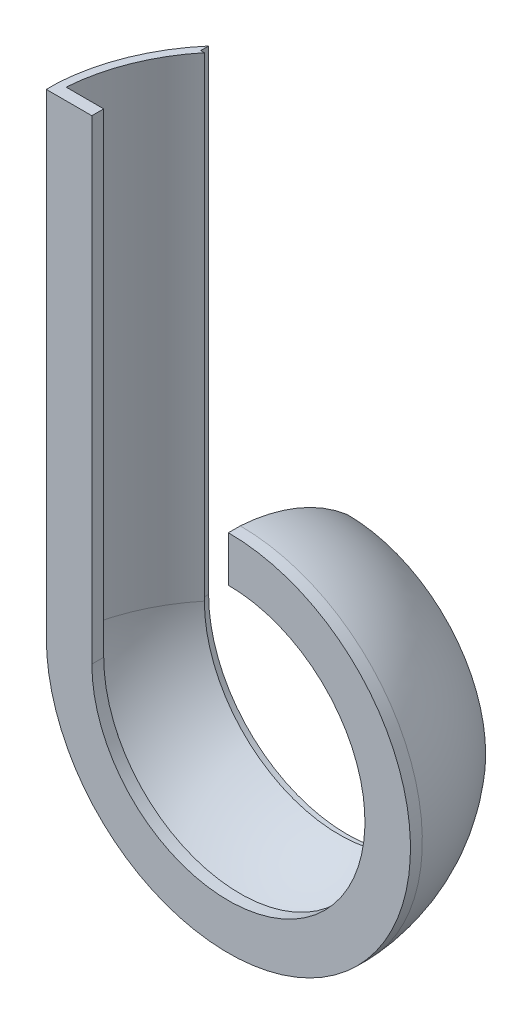
ISO-10303-21;
HEADER;
FILE_DESCRIPTION(('STEP AP214'),'2;1');
FILE_NAME('part.step','',(''),(''),'','','');
FILE_SCHEMA(('AUTOMOTIVE_DESIGN { 1 0 10303 214 1 1 1 1 }'));
ENDSEC;
DATA;
#1=APPLICATION_CONTEXT('core data for automotive mechanical design processes');
#2=APPLICATION_PROTOCOL_DEFINITION('international standard','automotive_design',2000,#1);
#3=PRODUCT_CONTEXT('',#1,'mechanical');
#4=PRODUCT('Part','Part','',(#3));
#5=PRODUCT_RELATED_PRODUCT_CATEGORY('part','',(#4));
#6=PRODUCT_DEFINITION_FORMATION('','',#4);
#7=PRODUCT_DEFINITION_CONTEXT('part definition',#1,'design');
#8=PRODUCT_DEFINITION('design','',#6,#7);
#9=PRODUCT_DEFINITION_SHAPE('','',#8);
#10=(LENGTH_UNIT() NAMED_UNIT(*) SI_UNIT(.MILLI.,.METRE.));
#11=(NAMED_UNIT(*) PLANE_ANGLE_UNIT() SI_UNIT($,.RADIAN.));
#12=(NAMED_UNIT(*) SI_UNIT($,.STERADIAN.) SOLID_ANGLE_UNIT());
#13=UNCERTAINTY_MEASURE_WITH_UNIT(LENGTH_MEASURE(1.E-05),#10,'distance_accuracy_value','');
#14=(GEOMETRIC_REPRESENTATION_CONTEXT(3) GLOBAL_UNCERTAINTY_ASSIGNED_CONTEXT((#13)) GLOBAL_UNIT_ASSIGNED_CONTEXT((#10,
#11,#12)) REPRESENTATION_CONTEXT('',''));
#15=CARTESIAN_POINT('',(0.,0.,0.));
#16=DIRECTION('',(0.,0.,1.));
#17=DIRECTION('',(1.,0.,0.));
#18=AXIS2_PLACEMENT_3D('',#15,#16,#17);
#19=CARTESIAN_POINT('',(-4.81824424760352E-13,46.,0.));
#20=DIRECTION('',(0.,0.,1.));
#21=DIRECTION('',(1.,0.,0.));
#22=AXIS2_PLACEMENT_3D('',#19,#20,#21);
#23=PLANE('',#22);
#24=CARTESIAN_POINT('',(0.,0.,0.));
#25=DIRECTION('',(0.,0.,-1.));
#26=DIRECTION('',(-1.,0.,0.));
#27=AXIS2_PLACEMENT_3D('',#24,#25,#26);
#28=CIRCLE('',#27,34.5);
#29=CARTESIAN_POINT('',(-3.61368318570264E-13,34.5,0.));
#30=VERTEX_POINT('',#29);
#31=CARTESIAN_POINT('',(-34.5,0.,0.));
#32=VERTEX_POINT('',#31);
#33=EDGE_CURVE('E11',#30,#32,#28,.T.);
#34=ORIENTED_EDGE('',*,*,#33,.T.);
#35=DIRECTION('',(0.,-1.,0.));
#36=VECTOR('',#35,1.);
#37=CARTESIAN_POINT('',(-34.5,120.,0.));
#38=LINE('',#37,#36);
#39=CARTESIAN_POINT('',(-34.5,120.,0.));
#40=VERTEX_POINT('',#39);
#41=EDGE_CURVE('E135',#40,#32,#38,.T.);
#42=ORIENTED_EDGE('',*,*,#41,.F.);
#43=DIRECTION('',(1.,0.,0.));
#44=VECTOR('',#43,1.);
#45=CARTESIAN_POINT('',(-46.,120.,0.));
#46=LINE('',#45,#44);
#47=CARTESIAN_POINT('',(-46.,120.,0.));
#48=VERTEX_POINT('',#47);
#49=EDGE_CURVE('E142',#48,#40,#46,.T.);
#50=ORIENTED_EDGE('',*,*,#49,.F.);
#51=DIRECTION('',(0.,-1.,0.));
#52=VECTOR('',#51,1.);
#53=CARTESIAN_POINT('',(-46.,120.,0.));
#54=LINE('',#53,#52);
#55=CARTESIAN_POINT('',(-46.,0.,0.));
#56=VERTEX_POINT('',#55);
#57=EDGE_CURVE('E247',#48,#56,#54,.T.);
#58=ORIENTED_EDGE('',*,*,#57,.T.);
#59=CARTESIAN_POINT('',(0.,0.,0.));
#60=DIRECTION('',(0.,0.,-1.));
#61=DIRECTION('',(-1.,0.,0.));
#62=AXIS2_PLACEMENT_3D('',#59,#60,#61);
#63=CIRCLE('',#62,46.);
#64=CARTESIAN_POINT('',(-4.81824424760352E-13,46.,0.));
#65=VERTEX_POINT('',#64);
#66=EDGE_CURVE('E55',#65,#56,#63,.T.);
#67=ORIENTED_EDGE('',*,*,#66,.F.);
#68=DIRECTION('',(0.,-1.,0.));
#69=VECTOR('',#68,1.);
#70=CARTESIAN_POINT('',(-4.81824424760352E-13,46.,0.));
#71=LINE('',#70,#69);
#72=EDGE_CURVE('E178',#65,#30,#71,.T.);
#73=ORIENTED_EDGE('',*,*,#72,.T.);
#74=EDGE_LOOP('',(#34,#42,#50,#58,#67,#73));
#75=FACE_BOUND('',#74,.T.);
#76=ADVANCED_FACE('F39',(#75),#23,.T.);
#77=CARTESIAN_POINT('',(0.,0.,-42.));
#78=DIRECTION('',(0.,0.,-1.));
#79=DIRECTION('',(-1.,0.,0.));
#80=AXIS2_PLACEMENT_3D('',#77,#78,#79);
#81=CYLINDRICAL_SURFACE('',#80,34.5);
#82=CARTESIAN_POINT('',(0.,0.,-3.));
#83=DIRECTION('',(0.,0.,-1.));
#84=DIRECTION('',(-1.,0.,0.));
#85=AXIS2_PLACEMENT_3D('',#82,#83,#84);
#86=CIRCLE('',#85,34.5);
#87=CARTESIAN_POINT('',(-3.61368318570264E-13,34.5,-3.));
#88=VERTEX_POINT('',#87);
#89=CARTESIAN_POINT('',(-34.5,0.,-3.));
#90=VERTEX_POINT('',#89);
#91=EDGE_CURVE('E48',#88,#90,#86,.T.);
#92=ORIENTED_EDGE('',*,*,#91,.T.);
#93=DIRECTION('',(0.,0.,-1.));
#94=VECTOR('',#93,1.);
#95=CARTESIAN_POINT('',(-34.5,0.,0.));
#96=LINE('',#95,#94);
#97=EDGE_CURVE('E153',#32,#90,#96,.T.);
#98=ORIENTED_EDGE('',*,*,#97,.F.);
#99=ORIENTED_EDGE('',*,*,#33,.F.);
#100=DIRECTION('',(0.,0.,-1.));
#101=VECTOR('',#100,1.);
#102=CARTESIAN_POINT('',(-3.61368318570264E-13,34.5,0.));
#103=LINE('',#102,#101);
#104=EDGE_CURVE('E181',#30,#88,#103,.T.);
#105=ORIENTED_EDGE('',*,*,#104,.T.);
#106=EDGE_LOOP('',(#92,#98,#99,#105));
#107=FACE_BOUND('',#106,.T.);
#108=ADVANCED_FACE('F41',(#107),#81,.F.);
#109=CARTESIAN_POINT('',(-4.50401092710764E-13,43.,-2.99999999999999));
#110=DIRECTION('',(0.,0.,-1.));
#111=DIRECTION('',(-1.,0.,0.));
#112=AXIS2_PLACEMENT_3D('',#109,#110,#111);
#113=PLANE('',#112);
#114=CARTESIAN_POINT('',(0.,0.,-3.));
#115=DIRECTION('',(0.,0.,-1.));
#116=DIRECTION('',(-1.,0.,0.));
#117=AXIS2_PLACEMENT_3D('',#114,#115,#116);
#118=CIRCLE('',#117,43.9955578571969);
#119=CARTESIAN_POINT('',(-4.6082900775119E-13,43.9955578571969,-2.99999999999999));
#120=VERTEX_POINT('',#119);
#121=CARTESIAN_POINT('',(-43.9955578571969,0.,-2.99999999999999));
#122=VERTEX_POINT('',#121);
#123=EDGE_CURVE('E219',#120,#122,#118,.T.);
#124=ORIENTED_EDGE('',*,*,#123,.T.);
#125=DIRECTION('',(0.,-1.,0.));
#126=VECTOR('',#125,1.);
#127=CARTESIAN_POINT('',(-43.9955578571969,120.,-2.99999999999999));
#128=LINE('',#127,#126);
#129=CARTESIAN_POINT('',(-43.9955578571969,120.,-2.99999999999999));
#130=VERTEX_POINT('',#129);
#131=EDGE_CURVE('E159',#130,#122,#128,.T.);
#132=ORIENTED_EDGE('',*,*,#131,.F.);
#133=DIRECTION('',(-1.,0.,0.));
#134=VECTOR('',#133,1.);
#135=CARTESIAN_POINT('',(-43.,120.,-2.99999999999999));
#136=LINE('',#135,#134);
#137=CARTESIAN_POINT('',(-34.5,120.,-3.));
#138=VERTEX_POINT('',#137);
#139=EDGE_CURVE('E141',#138,#130,#136,.T.);
#140=ORIENTED_EDGE('',*,*,#139,.F.);
#141=DIRECTION('',(0.,-1.,0.));
#142=VECTOR('',#141,1.);
#143=CARTESIAN_POINT('',(-34.5,120.,-3.));
#144=LINE('',#143,#142);
#145=EDGE_CURVE('E137',#138,#90,#144,.T.);
#146=ORIENTED_EDGE('',*,*,#145,.T.);
#147=ORIENTED_EDGE('',*,*,#91,.F.);
#148=DIRECTION('',(0.,1.,0.));
#149=VECTOR('',#148,1.);
#150=CARTESIAN_POINT('',(-4.50401092710764E-13,43.,-2.99999999999999));
#151=LINE('',#150,#149);
#152=EDGE_CURVE('E185',#88,#120,#151,.T.);
#153=ORIENTED_EDGE('',*,*,#152,.T.);
#154=EDGE_LOOP('',(#124,#132,#140,#146,#147,#153));
#155=FACE_BOUND('',#154,.T.);
#156=ADVANCED_FACE('F226',(#155),#113,.T.);
#157=CARTESIAN_POINT('',(0.,0.,0.));
#158=DIRECTION('',(0.,0.,-1.));
#159=DIRECTION('',(0.,1.,0.));
#160=AXIS2_PLACEMENT_3D('',#157,#158,#159);
#161=SPHERICAL_SURFACE('',#160,44.09772229);
#162=CARTESIAN_POINT('',(0.,0.,-28.));
#163=DIRECTION('',(0.,0.,-1.));
#164=DIRECTION('',(-1.,0.,0.));
#165=AXIS2_PLACEMENT_3D('',#162,#163,#164);
#166=CIRCLE('',#165,34.0677136181159);
#167=CARTESIAN_POINT('',(-3.56840359064112E-13,34.0677136181159,-28.));
#168=VERTEX_POINT('',#167);
#169=CARTESIAN_POINT('',(-34.0677136181159,0.,-28.));
#170=VERTEX_POINT('',#169);
#171=EDGE_CURVE('E216',#168,#170,#166,.T.);
#172=ORIENTED_EDGE('',*,*,#171,.T.);
#173=CARTESIAN_POINT('',(0.,0.,0.));
#174=DIRECTION('',(0.,-1.,0.));
#175=DIRECTION('',(0.,0.,1.));
#176=AXIS2_PLACEMENT_3D('',#173,#174,#175);
#177=CIRCLE('',#176,44.09772229);
#178=EDGE_CURVE('E157',#122,#170,#177,.T.);
#179=ORIENTED_EDGE('',*,*,#178,.F.);
#180=ORIENTED_EDGE('',*,*,#123,.F.);
#181=CARTESIAN_POINT('',(0.,0.,0.));
#182=DIRECTION('',(-1.,0.,0.));
#183=DIRECTION('',(0.,0.,1.));
#184=AXIS2_PLACEMENT_3D('',#181,#182,#183);
#185=CIRCLE('',#184,44.09772229);
#186=EDGE_CURVE('E188',#120,#168,#185,.T.);
#187=ORIENTED_EDGE('',*,*,#186,.T.);
#188=EDGE_LOOP('',(#172,#179,#180,#187));
#189=FACE_BOUND('',#188,.T.);
#190=ADVANCED_FACE('F296',(#189),#161,.F.);
#191=CARTESIAN_POINT('',(-3.66605540578529E-13,35.,-28.));
#192=DIRECTION('',(0.,0.,-1.));
#193=DIRECTION('',(-1.,0.,0.));
#194=AXIS2_PLACEMENT_3D('',#191,#192,#193);
#195=PLANE('',#194);
#196=CARTESIAN_POINT('',(0.,0.,-28.));
#197=DIRECTION('',(0.,0.,-1.));
#198=DIRECTION('',(-1.,0.,0.));
#199=AXIS2_PLACEMENT_3D('',#196,#197,#198);
#200=CIRCLE('',#199,35.);
#201=CARTESIAN_POINT('',(-3.66605540578529E-13,35.,-28.));
#202=VERTEX_POINT('',#201);
#203=CARTESIAN_POINT('',(-35.,0.,-28.));
#204=VERTEX_POINT('',#203);
#205=EDGE_CURVE('E213',#202,#204,#200,.T.);
#206=ORIENTED_EDGE('',*,*,#205,.T.);
#207=DIRECTION('',(0.,-1.,0.));
#208=VECTOR('',#207,1.);
#209=CARTESIAN_POINT('',(-35.,120.,-28.));
#210=LINE('',#209,#208);
#211=CARTESIAN_POINT('',(-35.,120.,-28.));
#212=VERTEX_POINT('',#211);
#213=EDGE_CURVE('E258',#212,#204,#210,.T.);
#214=ORIENTED_EDGE('',*,*,#213,.F.);
#215=DIRECTION('',(-1.,0.,0.));
#216=VECTOR('',#215,1.);
#217=CARTESIAN_POINT('',(-35.,120.,-28.));
#218=LINE('',#217,#216);
#219=CARTESIAN_POINT('',(-34.0677136181159,120.,-28.));
#220=VERTEX_POINT('',#219);
#221=EDGE_CURVE('E234',#220,#212,#218,.T.);
#222=ORIENTED_EDGE('',*,*,#221,.F.);
#223=DIRECTION('',(0.,-1.,0.));
#224=VECTOR('',#223,1.);
#225=CARTESIAN_POINT('',(-34.0677136181159,120.,-28.));
#226=LINE('',#225,#224);
#227=EDGE_CURVE('E262',#220,#170,#226,.T.);
#228=ORIENTED_EDGE('',*,*,#227,.T.);
#229=ORIENTED_EDGE('',*,*,#171,.F.);
#230=DIRECTION('',(0.,1.,0.));
#231=VECTOR('',#230,1.);
#232=CARTESIAN_POINT('',(-3.66605540578529E-13,35.,-28.));
#233=LINE('',#232,#231);
#234=EDGE_CURVE('E192',#168,#202,#233,.T.);
#235=ORIENTED_EDGE('',*,*,#234,.T.);
#236=EDGE_LOOP('',(#206,#214,#222,#228,#229,#235));
#237=FACE_BOUND('',#236,.T.);
#238=ADVANCED_FACE('F275',(#237),#195,.T.);
#239=CARTESIAN_POINT('',(0.,0.,-42.));
#240=DIRECTION('',(0.,0.,-1.));
#241=DIRECTION('',(-1.,0.,0.));
#242=AXIS2_PLACEMENT_3D('',#239,#240,#241);
#243=CYLINDRICAL_SURFACE('',#242,35.);
#244=CARTESIAN_POINT('',(0.,0.,-30.));
#245=DIRECTION('',(0.,0.,-1.));
#246=DIRECTION('',(-1.,0.,0.));
#247=AXIS2_PLACEMENT_3D('',#244,#245,#246);
#248=CIRCLE('',#247,35.);
#249=CARTESIAN_POINT('',(-3.66605540578529E-13,35.,-30.));
#250=VERTEX_POINT('',#249);
#251=CARTESIAN_POINT('',(-35.,0.,-30.));
#252=VERTEX_POINT('',#251);
#253=EDGE_CURVE('E210',#250,#252,#248,.T.);
#254=ORIENTED_EDGE('',*,*,#253,.T.);
#255=DIRECTION('',(0.,0.,-1.));
#256=VECTOR('',#255,1.);
#257=CARTESIAN_POINT('',(-35.,0.,-30.));
#258=LINE('',#257,#256);
#259=EDGE_CURVE('E166',#204,#252,#258,.T.);
#260=ORIENTED_EDGE('',*,*,#259,.F.);
#261=ORIENTED_EDGE('',*,*,#205,.F.);
#262=DIRECTION('',(0.,0.,-1.));
#263=VECTOR('',#262,1.);
#264=CARTESIAN_POINT('',(-3.66605540578529E-13,35.,-30.));
#265=LINE('',#264,#263);
#266=EDGE_CURVE('E196',#202,#250,#265,.T.);
#267=ORIENTED_EDGE('',*,*,#266,.T.);
#268=EDGE_LOOP('',(#254,#260,#261,#267));
#269=FACE_BOUND('',#268,.T.);
#270=ADVANCED_FACE('F298',(#269),#243,.F.);
#271=CARTESIAN_POINT('',(0.,0.,0.));
#272=DIRECTION('',(0.,0.,-1.));
#273=DIRECTION('',(0.,1.,0.));
#274=AXIS2_PLACEMENT_3D('',#271,#272,#273);
#275=SPHERICAL_SURFACE('',#274,46.0977222864644);
#276=CARTESIAN_POINT('',(0.,0.,-3.00000000000004));
#277=DIRECTION('',(0.,0.,-1.));
#278=DIRECTION('',(-1.,0.,0.));
#279=AXIS2_PLACEMENT_3D('',#276,#277,#278);
#280=CIRCLE('',#279,46.);
#281=CARTESIAN_POINT('',(-4.81824424760352E-13,46.,-3.00000000000004));
#282=VERTEX_POINT('',#281);
#283=CARTESIAN_POINT('',(-46.,0.,-3.00000000000004));
#284=VERTEX_POINT('',#283);
#285=EDGE_CURVE('E63',#282,#284,#280,.T.);
#286=ORIENTED_EDGE('',*,*,#285,.T.);
#287=CARTESIAN_POINT('',(0.,0.,0.));
#288=DIRECTION('',(0.,1.,0.));
#289=DIRECTION('',(0.,0.,-1.));
#290=AXIS2_PLACEMENT_3D('',#287,#288,#289);
#291=CIRCLE('',#290,46.0977222864644);
#292=EDGE_CURVE('E170',#252,#284,#291,.T.);
#293=ORIENTED_EDGE('',*,*,#292,.F.);
#294=ORIENTED_EDGE('',*,*,#253,.F.);
#295=CARTESIAN_POINT('',(0.,0.,0.));
#296=DIRECTION('',(1.,0.,0.));
#297=DIRECTION('',(0.,0.,-1.));
#298=AXIS2_PLACEMENT_3D('',#295,#296,#297);
#299=CIRCLE('',#298,46.0977222864644);
#300=EDGE_CURVE('E200',#250,#282,#299,.T.);
#301=ORIENTED_EDGE('',*,*,#300,.T.);
#302=EDGE_LOOP('',(#286,#293,#294,#301));
#303=FACE_BOUND('',#302,.T.);
#304=ADVANCED_FACE('F300',(#303),#275,.T.);
#305=CARTESIAN_POINT('',(0.,0.,-42.));
#306=DIRECTION('',(0.,0.,-1.));
#307=DIRECTION('',(-1.,0.,0.));
#308=AXIS2_PLACEMENT_3D('',#305,#306,#307);
#309=CYLINDRICAL_SURFACE('',#308,46.);
#310=DIRECTION('',(0.,0.,1.));
#311=VECTOR('',#310,1.);
#312=CARTESIAN_POINT('',(-4.81824424760352E-13,46.,-3.00000000000005));
#313=LINE('',#312,#311);
#314=EDGE_CURVE('E203',#282,#65,#313,.T.);
#315=ORIENTED_EDGE('',*,*,#314,.T.);
#316=ORIENTED_EDGE('',*,*,#66,.T.);
#317=DIRECTION('',(0.,0.,1.));
#318=VECTOR('',#317,1.);
#319=CARTESIAN_POINT('',(-46.,0.,-3.00000000000005));
#320=LINE('',#319,#318);
#321=EDGE_CURVE('E174',#284,#56,#320,.T.);
#322=ORIENTED_EDGE('',*,*,#321,.F.);
#323=ORIENTED_EDGE('',*,*,#285,.F.);
#324=EDGE_LOOP('',(#315,#316,#322,#323));
#325=FACE_BOUND('',#324,.T.);
#326=ADVANCED_FACE('F286',(#325),#309,.T.);
#327=CARTESIAN_POINT('',(0.,0.,0.));
#328=DIRECTION('',(1.,0.,0.));
#329=DIRECTION('',(0.,0.,1.));
#330=AXIS2_PLACEMENT_3D('',#327,#328,#329);
#331=PLANE('',#330);
#332=ORIENTED_EDGE('',*,*,#72,.F.);
#333=ORIENTED_EDGE('',*,*,#314,.F.);
#334=ORIENTED_EDGE('',*,*,#300,.F.);
#335=ORIENTED_EDGE('',*,*,#266,.F.);
#336=ORIENTED_EDGE('',*,*,#234,.F.);
#337=ORIENTED_EDGE('',*,*,#186,.F.);
#338=ORIENTED_EDGE('',*,*,#152,.F.);
#339=ORIENTED_EDGE('',*,*,#104,.F.);
#340=EDGE_LOOP('',(#332,#333,#334,#335,#336,#337,#338,#339));
#341=FACE_BOUND('',#340,.T.);
#342=ADVANCED_FACE('F290',(#341),#331,.F.);
#343=CARTESIAN_POINT('',(-34.5,120.,0.));
#344=DIRECTION('',(-1.,0.,0.));
#345=DIRECTION('',(0.,0.,1.));
#346=AXIS2_PLACEMENT_3D('',#343,#344,#345);
#347=PLANE('',#346);
#348=ORIENTED_EDGE('',*,*,#97,.T.);
#349=ORIENTED_EDGE('',*,*,#145,.F.);
#350=DIRECTION('',(0.,0.,-1.));
#351=VECTOR('',#350,1.);
#352=CARTESIAN_POINT('',(-34.5,120.,0.));
#353=LINE('',#352,#351);
#354=EDGE_CURVE('E130',#40,#138,#353,.T.);
#355=ORIENTED_EDGE('',*,*,#354,.F.);
#356=ORIENTED_EDGE('',*,*,#41,.T.);
#357=EDGE_LOOP('',(#348,#349,#355,#356));
#358=FACE_BOUND('',#357,.T.);
#359=ADVANCED_FACE('F133',(#358),#347,.F.);
#360=CARTESIAN_POINT('',(0.,120.,0.));
#361=DIRECTION('',(0.,-1.,0.));
#362=DIRECTION('',(0.,0.,-1.));
#363=AXIS2_PLACEMENT_3D('',#360,#361,#362);
#364=CYLINDRICAL_SURFACE('',#363,44.09772229);
#365=ORIENTED_EDGE('',*,*,#178,.T.);
#366=ORIENTED_EDGE('',*,*,#227,.F.);
#367=CARTESIAN_POINT('',(0.,120.,0.));
#368=DIRECTION('',(0.,-1.,0.));
#369=DIRECTION('',(0.,0.,1.));
#370=AXIS2_PLACEMENT_3D('',#367,#368,#369);
#371=CIRCLE('',#370,44.09772229);
#372=EDGE_CURVE('E231',#130,#220,#371,.T.);
#373=ORIENTED_EDGE('',*,*,#372,.F.);
#374=ORIENTED_EDGE('',*,*,#131,.T.);
#375=EDGE_LOOP('',(#365,#366,#373,#374));
#376=FACE_BOUND('',#375,.T.);
#377=ADVANCED_FACE('F267',(#376),#364,.F.);
#378=CARTESIAN_POINT('',(-35.,120.,-30.));
#379=DIRECTION('',(-1.,0.,0.));
#380=DIRECTION('',(0.,0.,1.));
#381=AXIS2_PLACEMENT_3D('',#378,#379,#380);
#382=PLANE('',#381);
#383=ORIENTED_EDGE('',*,*,#259,.T.);
#384=DIRECTION('',(0.,-1.,0.));
#385=VECTOR('',#384,1.);
#386=CARTESIAN_POINT('',(-35.,120.,-30.));
#387=LINE('',#386,#385);
#388=CARTESIAN_POINT('',(-35.,120.,-30.));
#389=VERTEX_POINT('',#388);
#390=EDGE_CURVE('E254',#389,#252,#387,.T.);
#391=ORIENTED_EDGE('',*,*,#390,.F.);
#392=DIRECTION('',(0.,0.,-1.));
#393=VECTOR('',#392,1.);
#394=CARTESIAN_POINT('',(-35.,120.,-30.));
#395=LINE('',#394,#393);
#396=EDGE_CURVE('E239',#212,#389,#395,.T.);
#397=ORIENTED_EDGE('',*,*,#396,.F.);
#398=ORIENTED_EDGE('',*,*,#213,.T.);
#399=EDGE_LOOP('',(#383,#391,#397,#398));
#400=FACE_BOUND('',#399,.T.);
#401=ADVANCED_FACE('F278',(#400),#382,.F.);
#402=CARTESIAN_POINT('',(0.,120.,0.));
#403=DIRECTION('',(0.,-1.,0.));
#404=DIRECTION('',(0.,0.,-1.));
#405=AXIS2_PLACEMENT_3D('',#402,#403,#404);
#406=CYLINDRICAL_SURFACE('',#405,46.0977222864644);
#407=ORIENTED_EDGE('',*,*,#292,.T.);
#408=DIRECTION('',(0.,-1.,0.));
#409=VECTOR('',#408,1.);
#410=CARTESIAN_POINT('',(-46.,120.,-3.00000000000004));
#411=LINE('',#410,#409);
#412=CARTESIAN_POINT('',(-46.,120.,-3.00000000000004));
#413=VERTEX_POINT('',#412);
#414=EDGE_CURVE('E250',#413,#284,#411,.T.);
#415=ORIENTED_EDGE('',*,*,#414,.F.);
#416=CARTESIAN_POINT('',(0.,120.,0.));
#417=DIRECTION('',(0.,1.,0.));
#418=DIRECTION('',(0.,0.,-1.));
#419=AXIS2_PLACEMENT_3D('',#416,#417,#418);
#420=CIRCLE('',#419,46.0977222864644);
#421=EDGE_CURVE('E242',#389,#413,#420,.T.);
#422=ORIENTED_EDGE('',*,*,#421,.F.);
#423=ORIENTED_EDGE('',*,*,#390,.T.);
#424=EDGE_LOOP('',(#407,#415,#422,#423));
#425=FACE_BOUND('',#424,.T.);
#426=ADVANCED_FACE('F282',(#425),#406,.T.);
#427=CARTESIAN_POINT('',(-46.,120.,-3.00000000000005));
#428=DIRECTION('',(1.,0.,0.));
#429=DIRECTION('',(0.,0.,-1.));
#430=AXIS2_PLACEMENT_3D('',#427,#428,#429);
#431=PLANE('',#430);
#432=ORIENTED_EDGE('',*,*,#321,.T.);
#433=ORIENTED_EDGE('',*,*,#57,.F.);
#434=DIRECTION('',(0.,0.,1.));
#435=VECTOR('',#434,1.);
#436=CARTESIAN_POINT('',(-46.,120.,-3.00000000000005));
#437=LINE('',#436,#435);
#438=EDGE_CURVE('E147',#413,#48,#437,.T.);
#439=ORIENTED_EDGE('',*,*,#438,.F.);
#440=ORIENTED_EDGE('',*,*,#414,.T.);
#441=EDGE_LOOP('',(#432,#433,#439,#440));
#442=FACE_BOUND('',#441,.T.);
#443=ADVANCED_FACE('F285',(#442),#431,.F.);
#444=CARTESIAN_POINT('',(0.,120.,0.));
#445=DIRECTION('',(0.,1.,0.));
#446=DIRECTION('',(0.,0.,1.));
#447=AXIS2_PLACEMENT_3D('',#444,#445,#446);
#448=PLANE('',#447);
#449=ORIENTED_EDGE('',*,*,#49,.T.);
#450=ORIENTED_EDGE('',*,*,#354,.T.);
#451=ORIENTED_EDGE('',*,*,#139,.T.);
#452=ORIENTED_EDGE('',*,*,#372,.T.);
#453=ORIENTED_EDGE('',*,*,#221,.T.);
#454=ORIENTED_EDGE('',*,*,#396,.T.);
#455=ORIENTED_EDGE('',*,*,#421,.T.);
#456=ORIENTED_EDGE('',*,*,#438,.T.);
#457=EDGE_LOOP('',(#449,#450,#451,#452,#453,#454,#455,#456));
#458=FACE_BOUND('',#457,.T.);
#459=ADVANCED_FACE('F145',(#458),#448,.T.);
#460=CLOSED_SHELL('',(#76,#108,#156,#190,#238,#270,#304,#326,#342,#359,#377,#401,#426,#443,#459));
#461=MANIFOLD_SOLID_BREP('B2',#460);
#462=ADVANCED_BREP_SHAPE_REPRESENTATION('',(#18,#461),#14);
#463=SHAPE_DEFINITION_REPRESENTATION(#9,#462);
ENDSEC;
END-ISO-10303-21;
